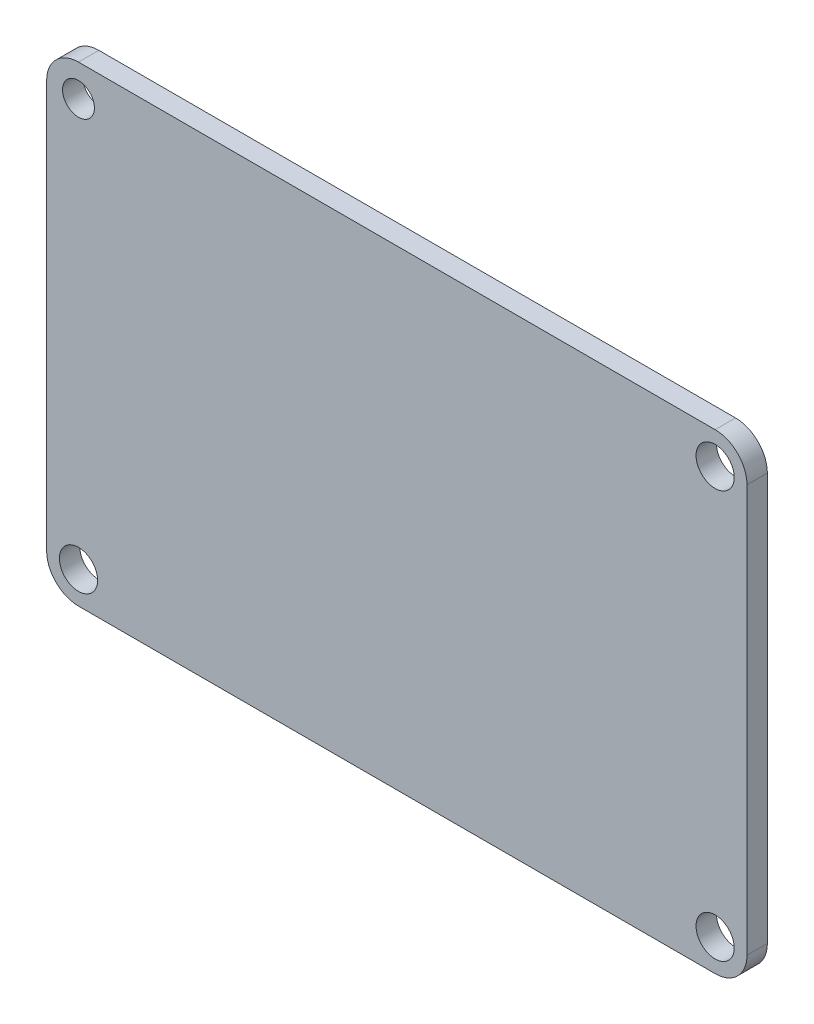
ISO-10303-21;
HEADER;
FILE_DESCRIPTION(('STEP AP214'),'2;1');
FILE_NAME('part.step','',(''),(''),'','','');
FILE_SCHEMA(('AUTOMOTIVE_DESIGN { 1 0 10303 214 1 1 1 1 }'));
ENDSEC;
DATA;
#1=APPLICATION_CONTEXT('core data for automotive mechanical design processes');
#2=APPLICATION_PROTOCOL_DEFINITION('international standard','automotive_design',2000,#1);
#3=PRODUCT_CONTEXT('',#1,'mechanical');
#4=PRODUCT('Part','Part','',(#3));
#5=PRODUCT_RELATED_PRODUCT_CATEGORY('part','',(#4));
#6=PRODUCT_DEFINITION_FORMATION('','',#4);
#7=PRODUCT_DEFINITION_CONTEXT('part definition',#1,'design');
#8=PRODUCT_DEFINITION('design','',#6,#7);
#9=PRODUCT_DEFINITION_SHAPE('','',#8);
#10=(LENGTH_UNIT() NAMED_UNIT(*) SI_UNIT(.MILLI.,.METRE.));
#11=(NAMED_UNIT(*) PLANE_ANGLE_UNIT() SI_UNIT($,.RADIAN.));
#12=(NAMED_UNIT(*) SI_UNIT($,.STERADIAN.) SOLID_ANGLE_UNIT());
#13=UNCERTAINTY_MEASURE_WITH_UNIT(LENGTH_MEASURE(1.E-05),#10,'distance_accuracy_value','');
#14=(GEOMETRIC_REPRESENTATION_CONTEXT(3) GLOBAL_UNCERTAINTY_ASSIGNED_CONTEXT((#13)) GLOBAL_UNIT_ASSIGNED_CONTEXT((#10,
#11,#12)) REPRESENTATION_CONTEXT('',''));
#15=CARTESIAN_POINT('',(0.,0.,0.));
#16=DIRECTION('',(0.,0.,1.));
#17=DIRECTION('',(1.,0.,0.));
#18=AXIS2_PLACEMENT_3D('',#15,#16,#17);
#19=CARTESIAN_POINT('',(27.5,-18.5,1.6));
#20=DIRECTION('',(-1.,0.,0.));
#21=DIRECTION('',(0.,0.,1.));
#22=AXIS2_PLACEMENT_3D('',#19,#20,#21);
#23=PLANE('',#22);
#24=DIRECTION('',(0.,0.,-1.));
#25=VECTOR('',#24,1.);
#26=CARTESIAN_POINT('',(27.5,16.,5.13553390593293));
#27=LINE('',#26,#25);
#28=CARTESIAN_POINT('',(27.5,16.,1.6));
#29=VERTEX_POINT('',#28);
#30=CARTESIAN_POINT('',(27.5,16.,0.));
#31=VERTEX_POINT('',#30);
#32=EDGE_CURVE('E106',#29,#31,#27,.T.);
#33=ORIENTED_EDGE('',*,*,#32,.F.);
#34=DIRECTION('',(0.,1.,0.));
#35=VECTOR('',#34,1.);
#36=CARTESIAN_POINT('',(27.5,-18.5,1.6));
#37=LINE('',#36,#35);
#38=CARTESIAN_POINT('',(27.5,-15.9999999999998,1.6));
#39=VERTEX_POINT('',#38);
#40=EDGE_CURVE('E136',#39,#29,#37,.T.);
#41=ORIENTED_EDGE('',*,*,#40,.F.);
#42=DIRECTION('',(0.,0.,-1.));
#43=VECTOR('',#42,1.);
#44=CARTESIAN_POINT('',(27.5,-15.9999999999998,5.13553390593293));
#45=LINE('',#44,#43);
#46=CARTESIAN_POINT('',(27.5,-15.9999999999998,0.));
#47=VERTEX_POINT('',#46);
#48=EDGE_CURVE('E141',#39,#47,#45,.T.);
#49=ORIENTED_EDGE('',*,*,#48,.T.);
#50=DIRECTION('',(0.,1.,0.));
#51=VECTOR('',#50,1.);
#52=CARTESIAN_POINT('',(27.5,-18.5,0.));
#53=LINE('',#52,#51);
#54=EDGE_CURVE('E127',#47,#31,#53,.T.);
#55=ORIENTED_EDGE('',*,*,#54,.T.);
#56=EDGE_LOOP('',(#33,#41,#49,#55));
#57=FACE_BOUND('',#56,.T.);
#58=ADVANCED_FACE('F35',(#57),#23,.F.);
#59=CARTESIAN_POINT('',(-27.5,18.5,1.6));
#60=DIRECTION('',(0.,-1.,0.));
#61=DIRECTION('',(0.,0.,-1.));
#62=AXIS2_PLACEMENT_3D('',#59,#60,#61);
#63=PLANE('',#62);
#64=DIRECTION('',(0.,0.,-1.));
#65=VECTOR('',#64,1.);
#66=CARTESIAN_POINT('',(-25.,18.5,5.13553390593293));
#67=LINE('',#66,#65);
#68=CARTESIAN_POINT('',(-25.,18.5,1.6));
#69=VERTEX_POINT('',#68);
#70=CARTESIAN_POINT('',(-25.,18.5,0.));
#71=VERTEX_POINT('',#70);
#72=EDGE_CURVE('E51',#69,#71,#67,.T.);
#73=ORIENTED_EDGE('',*,*,#72,.F.);
#74=DIRECTION('',(-1.,0.,0.));
#75=VECTOR('',#74,1.);
#76=CARTESIAN_POINT('',(-27.5,18.5,1.6));
#77=LINE('',#76,#75);
#78=CARTESIAN_POINT('',(24.9999999999999,18.5,1.6));
#79=VERTEX_POINT('',#78);
#80=EDGE_CURVE('E119',#79,#69,#77,.T.);
#81=ORIENTED_EDGE('',*,*,#80,.F.);
#82=DIRECTION('',(0.,0.,-1.));
#83=VECTOR('',#82,1.);
#84=CARTESIAN_POINT('',(24.9999999999999,18.5,5.13553390593293));
#85=LINE('',#84,#83);
#86=CARTESIAN_POINT('',(24.9999999999999,18.5,0.));
#87=VERTEX_POINT('',#86);
#88=EDGE_CURVE('E103',#79,#87,#85,.T.);
#89=ORIENTED_EDGE('',*,*,#88,.T.);
#90=DIRECTION('',(-1.,0.,0.));
#91=VECTOR('',#90,1.);
#92=CARTESIAN_POINT('',(-27.5,18.5,0.));
#93=LINE('',#92,#91);
#94=EDGE_CURVE('E117',#87,#71,#93,.T.);
#95=ORIENTED_EDGE('',*,*,#94,.T.);
#96=EDGE_LOOP('',(#73,#81,#89,#95));
#97=FACE_BOUND('',#96,.T.);
#98=ADVANCED_FACE('F116',(#97),#63,.F.);
#99=CARTESIAN_POINT('',(-27.5,-18.5,1.6));
#100=DIRECTION('',(1.,0.,0.));
#101=DIRECTION('',(0.,0.,-1.));
#102=AXIS2_PLACEMENT_3D('',#99,#100,#101);
#103=PLANE('',#102);
#104=DIRECTION('',(0.,0.,-1.));
#105=VECTOR('',#104,1.);
#106=CARTESIAN_POINT('',(-27.5,-16.,5.13553390593293));
#107=LINE('',#106,#105);
#108=CARTESIAN_POINT('',(-27.5,-16.,1.6));
#109=VERTEX_POINT('',#108);
#110=CARTESIAN_POINT('',(-27.5,-16.,0.));
#111=VERTEX_POINT('',#110);
#112=EDGE_CURVE('E59',#109,#111,#107,.T.);
#113=ORIENTED_EDGE('',*,*,#112,.F.);
#114=DIRECTION('',(0.,-1.,0.));
#115=VECTOR('',#114,1.);
#116=CARTESIAN_POINT('',(-27.5,-18.5,1.6));
#117=LINE('',#116,#115);
#118=CARTESIAN_POINT('',(-27.5,16.,1.6));
#119=VERTEX_POINT('',#118);
#120=EDGE_CURVE('E43',#119,#109,#117,.T.);
#121=ORIENTED_EDGE('',*,*,#120,.F.);
#122=DIRECTION('',(0.,0.,-1.));
#123=VECTOR('',#122,1.);
#124=CARTESIAN_POINT('',(-27.5,16.,5.13553390593293));
#125=LINE('',#124,#123);
#126=CARTESIAN_POINT('',(-27.5,16.,0.));
#127=VERTEX_POINT('',#126);
#128=EDGE_CURVE('E159',#119,#127,#125,.T.);
#129=ORIENTED_EDGE('',*,*,#128,.T.);
#130=DIRECTION('',(0.,-1.,0.));
#131=VECTOR('',#130,1.);
#132=CARTESIAN_POINT('',(-27.5,-18.5,0.));
#133=LINE('',#132,#131);
#134=EDGE_CURVE('E126',#127,#111,#133,.T.);
#135=ORIENTED_EDGE('',*,*,#134,.T.);
#136=EDGE_LOOP('',(#113,#121,#129,#135));
#137=FACE_BOUND('',#136,.T.);
#138=ADVANCED_FACE('F223',(#137),#103,.F.);
#139=CARTESIAN_POINT('',(-27.5,-18.5,1.6));
#140=DIRECTION('',(0.,1.,0.));
#141=DIRECTION('',(0.,0.,1.));
#142=AXIS2_PLACEMENT_3D('',#139,#140,#141);
#143=PLANE('',#142);
#144=DIRECTION('',(1.,0.,0.));
#145=VECTOR('',#144,1.);
#146=CARTESIAN_POINT('',(-27.5,-18.5,1.6));
#147=LINE('',#146,#145);
#148=CARTESIAN_POINT('',(-25.,-18.5,1.6));
#149=VERTEX_POINT('',#148);
#150=CARTESIAN_POINT('',(25.0000000000001,-18.5,1.6));
#151=VERTEX_POINT('',#150);
#152=EDGE_CURVE('E11',#149,#151,#147,.T.);
#153=ORIENTED_EDGE('',*,*,#152,.F.);
#154=DIRECTION('',(0.,0.,-1.));
#155=VECTOR('',#154,1.);
#156=CARTESIAN_POINT('',(-25.,-18.5,5.13553390593293));
#157=LINE('',#156,#155);
#158=CARTESIAN_POINT('',(-25.,-18.5,0.));
#159=VERTEX_POINT('',#158);
#160=EDGE_CURVE('E151',#149,#159,#157,.T.);
#161=ORIENTED_EDGE('',*,*,#160,.T.);
#162=DIRECTION('',(1.,0.,0.));
#163=VECTOR('',#162,1.);
#164=CARTESIAN_POINT('',(-27.5,-18.5,0.));
#165=LINE('',#164,#163);
#166=CARTESIAN_POINT('',(25.0000000000001,-18.5,0.));
#167=VERTEX_POINT('',#166);
#168=EDGE_CURVE('E38',#159,#167,#165,.T.);
#169=ORIENTED_EDGE('',*,*,#168,.T.);
#170=DIRECTION('',(0.,0.,-1.));
#171=VECTOR('',#170,1.);
#172=CARTESIAN_POINT('',(25.0000000000001,-18.5,5.13553390593293));
#173=LINE('',#172,#171);
#174=EDGE_CURVE('E139',#151,#167,#173,.T.);
#175=ORIENTED_EDGE('',*,*,#174,.F.);
#176=EDGE_LOOP('',(#153,#161,#169,#175));
#177=FACE_BOUND('',#176,.T.);
#178=ADVANCED_FACE('F231',(#177),#143,.F.);
#179=CARTESIAN_POINT('',(0.,0.,1.6));
#180=DIRECTION('',(0.,0.,-1.));
#181=DIRECTION('',(-1.,0.,0.));
#182=AXIS2_PLACEMENT_3D('',#179,#180,#181);
#183=PLANE('',#182);
#184=CARTESIAN_POINT('',(-25.,-16.,1.6));
#185=DIRECTION('',(0.,0.,-1.));
#186=DIRECTION('',(-1.,0.,0.));
#187=AXIS2_PLACEMENT_3D('',#184,#185,#186);
#188=CIRCLE('',#187,1.5);
#189=CARTESIAN_POINT('',(-26.5,-16.,1.6));
#190=VERTEX_POINT('',#189);
#191=EDGE_CURVE('E173',#190,#190,#188,.F.);
#192=ORIENTED_EDGE('',*,*,#191,.F.);
#193=EDGE_LOOP('',(#192));
#194=FACE_BOUND('',#193,.T.);
#195=CARTESIAN_POINT('',(24.9999999999999,16.,1.6));
#196=DIRECTION('',(0.,0.,-1.));
#197=DIRECTION('',(-1.,0.,0.));
#198=AXIS2_PLACEMENT_3D('',#195,#196,#197);
#199=CIRCLE('',#198,1.5);
#200=CARTESIAN_POINT('',(23.4999999999999,16.,1.6));
#201=VERTEX_POINT('',#200);
#202=EDGE_CURVE('E174',#201,#201,#199,.F.);
#203=ORIENTED_EDGE('',*,*,#202,.F.);
#204=EDGE_LOOP('',(#203));
#205=FACE_BOUND('',#204,.T.);
#206=CARTESIAN_POINT('',(25.0000000000001,-15.9999999999998,1.6));
#207=DIRECTION('',(0.,0.,-1.));
#208=DIRECTION('',(-1.,0.,0.));
#209=AXIS2_PLACEMENT_3D('',#206,#207,#208);
#210=CIRCLE('',#209,1.5);
#211=CARTESIAN_POINT('',(23.5000000000001,-15.9999999999998,1.6));
#212=VERTEX_POINT('',#211);
#213=EDGE_CURVE('E181',#212,#212,#210,.F.);
#214=ORIENTED_EDGE('',*,*,#213,.F.);
#215=EDGE_LOOP('',(#214));
#216=FACE_BOUND('',#215,.T.);
#217=CARTESIAN_POINT('',(-25.,16.,1.6));
#218=DIRECTION('',(0.,0.,-1.));
#219=DIRECTION('',(-1.,0.,0.));
#220=AXIS2_PLACEMENT_3D('',#217,#218,#219);
#221=CIRCLE('',#220,1.25036381722104);
#222=CARTESIAN_POINT('',(-26.250363817221,16.,1.6));
#223=VERTEX_POINT('',#222);
#224=EDGE_CURVE('E156',#223,#223,#221,.F.);
#225=ORIENTED_EDGE('',*,*,#224,.F.);
#226=EDGE_LOOP('',(#225));
#227=FACE_BOUND('',#226,.T.);
#228=CARTESIAN_POINT('',(-25.,-16.,1.6));
#229=DIRECTION('',(0.,0.,-1.));
#230=DIRECTION('',(-1.,0.,0.));
#231=AXIS2_PLACEMENT_3D('',#228,#229,#230);
#232=CIRCLE('',#231,2.5);
#233=EDGE_CURVE('E150',#109,#149,#232,.F.);
#234=ORIENTED_EDGE('',*,*,#233,.T.);
#235=ORIENTED_EDGE('',*,*,#152,.T.);
#236=CARTESIAN_POINT('',(25.0000000000001,-15.9999999999998,1.6));
#237=DIRECTION('',(0.,0.,-1.));
#238=DIRECTION('',(-1.,0.,0.));
#239=AXIS2_PLACEMENT_3D('',#236,#237,#238);
#240=CIRCLE('',#239,2.50000000000005);
#241=EDGE_CURVE('E130',#151,#39,#240,.F.);
#242=ORIENTED_EDGE('',*,*,#241,.T.);
#243=ORIENTED_EDGE('',*,*,#40,.T.);
#244=CARTESIAN_POINT('',(24.9999999999999,16.,1.6));
#245=DIRECTION('',(0.,0.,-1.));
#246=DIRECTION('',(-1.,0.,0.));
#247=AXIS2_PLACEMENT_3D('',#244,#245,#246);
#248=CIRCLE('',#247,2.50000000000005);
#249=EDGE_CURVE('E120',#29,#79,#248,.F.);
#250=ORIENTED_EDGE('',*,*,#249,.T.);
#251=ORIENTED_EDGE('',*,*,#80,.T.);
#252=CARTESIAN_POINT('',(-25.,16.,1.6));
#253=DIRECTION('',(0.,0.,-1.));
#254=DIRECTION('',(-1.,0.,0.));
#255=AXIS2_PLACEMENT_3D('',#252,#253,#254);
#256=CIRCLE('',#255,2.5);
#257=EDGE_CURVE('E111',#69,#119,#256,.F.);
#258=ORIENTED_EDGE('',*,*,#257,.T.);
#259=ORIENTED_EDGE('',*,*,#120,.T.);
#260=EDGE_LOOP('',(#234,#235,#242,#243,#250,#251,#258,#259));
#261=FACE_BOUND('',#260,.T.);
#262=ADVANCED_FACE('F197',(#194,#205,#216,#227,#261),#183,.F.);
#263=CARTESIAN_POINT('',(0.,0.,0.));
#264=DIRECTION('',(0.,0.,-1.));
#265=DIRECTION('',(-1.,0.,0.));
#266=AXIS2_PLACEMENT_3D('',#263,#264,#265);
#267=PLANE('',#266);
#268=CARTESIAN_POINT('',(-25.,-16.,0.));
#269=DIRECTION('',(0.,0.,-1.));
#270=DIRECTION('',(-1.,0.,0.));
#271=AXIS2_PLACEMENT_3D('',#268,#269,#270);
#272=CIRCLE('',#271,1.5);
#273=CARTESIAN_POINT('',(-26.5,-16.,0.));
#274=VERTEX_POINT('',#273);
#275=EDGE_CURVE('E177',#274,#274,#272,.T.);
#276=ORIENTED_EDGE('',*,*,#275,.F.);
#277=EDGE_LOOP('',(#276));
#278=FACE_BOUND('',#277,.T.);
#279=CARTESIAN_POINT('',(24.9999999999999,16.,0.));
#280=DIRECTION('',(0.,0.,-1.));
#281=DIRECTION('',(-1.,0.,0.));
#282=AXIS2_PLACEMENT_3D('',#279,#280,#281);
#283=CIRCLE('',#282,1.5);
#284=CARTESIAN_POINT('',(23.4999999999999,16.,0.));
#285=VERTEX_POINT('',#284);
#286=EDGE_CURVE('E178',#285,#285,#283,.T.);
#287=ORIENTED_EDGE('',*,*,#286,.F.);
#288=EDGE_LOOP('',(#287));
#289=FACE_BOUND('',#288,.T.);
#290=CARTESIAN_POINT('',(25.0000000000001,-15.9999999999998,0.));
#291=DIRECTION('',(0.,0.,-1.));
#292=DIRECTION('',(-1.,0.,0.));
#293=AXIS2_PLACEMENT_3D('',#290,#291,#292);
#294=CIRCLE('',#293,1.5);
#295=CARTESIAN_POINT('',(23.5000000000001,-15.9999999999998,0.));
#296=VERTEX_POINT('',#295);
#297=EDGE_CURVE('E188',#296,#296,#294,.T.);
#298=ORIENTED_EDGE('',*,*,#297,.F.);
#299=EDGE_LOOP('',(#298));
#300=FACE_BOUND('',#299,.T.);
#301=CARTESIAN_POINT('',(-25.,16.,0.));
#302=DIRECTION('',(0.,0.,-1.));
#303=DIRECTION('',(-1.,0.,0.));
#304=AXIS2_PLACEMENT_3D('',#301,#302,#303);
#305=CIRCLE('',#304,1.25036381722104);
#306=CARTESIAN_POINT('',(-26.250363817221,16.,0.));
#307=VERTEX_POINT('',#306);
#308=EDGE_CURVE('E170',#307,#307,#305,.T.);
#309=ORIENTED_EDGE('',*,*,#308,.F.);
#310=EDGE_LOOP('',(#309));
#311=FACE_BOUND('',#310,.T.);
#312=ORIENTED_EDGE('',*,*,#168,.F.);
#313=CARTESIAN_POINT('',(-25.,-16.,0.));
#314=DIRECTION('',(0.,0.,-1.));
#315=DIRECTION('',(-1.,0.,0.));
#316=AXIS2_PLACEMENT_3D('',#313,#314,#315);
#317=CIRCLE('',#316,2.5);
#318=EDGE_CURVE('E154',#159,#111,#317,.T.);
#319=ORIENTED_EDGE('',*,*,#318,.T.);
#320=ORIENTED_EDGE('',*,*,#134,.F.);
#321=CARTESIAN_POINT('',(-25.,16.,0.));
#322=DIRECTION('',(0.,0.,-1.));
#323=DIRECTION('',(-1.,0.,0.));
#324=AXIS2_PLACEMENT_3D('',#321,#322,#323);
#325=CIRCLE('',#324,2.5);
#326=EDGE_CURVE('E125',#127,#71,#325,.T.);
#327=ORIENTED_EDGE('',*,*,#326,.T.);
#328=ORIENTED_EDGE('',*,*,#94,.F.);
#329=CARTESIAN_POINT('',(24.9999999999999,16.,0.));
#330=DIRECTION('',(0.,0.,-1.));
#331=DIRECTION('',(-1.,0.,0.));
#332=AXIS2_PLACEMENT_3D('',#329,#330,#331);
#333=CIRCLE('',#332,2.50000000000005);
#334=EDGE_CURVE('E100',#87,#31,#333,.T.);
#335=ORIENTED_EDGE('',*,*,#334,.T.);
#336=ORIENTED_EDGE('',*,*,#54,.F.);
#337=CARTESIAN_POINT('',(25.0000000000001,-15.9999999999998,0.));
#338=DIRECTION('',(0.,0.,-1.));
#339=DIRECTION('',(-1.,0.,0.));
#340=AXIS2_PLACEMENT_3D('',#337,#338,#339);
#341=CIRCLE('',#340,2.50000000000005);
#342=EDGE_CURVE('E144',#47,#167,#341,.T.);
#343=ORIENTED_EDGE('',*,*,#342,.T.);
#344=EDGE_LOOP('',(#312,#319,#320,#327,#328,#335,#336,#343));
#345=FACE_BOUND('',#344,.T.);
#346=ADVANCED_FACE('F123',(#278,#289,#300,#311,#345),#267,.T.);
#347=CARTESIAN_POINT('',(25.0000000000001,-15.9999999999998,5.13553390593293));
#348=DIRECTION('',(0.,0.,-1.));
#349=DIRECTION('',(-1.,0.,0.));
#350=AXIS2_PLACEMENT_3D('',#347,#348,#349);
#351=CYLINDRICAL_SURFACE('',#350,2.50000000000005);
#352=ORIENTED_EDGE('',*,*,#174,.T.);
#353=ORIENTED_EDGE('',*,*,#342,.F.);
#354=ORIENTED_EDGE('',*,*,#48,.F.);
#355=ORIENTED_EDGE('',*,*,#241,.F.);
#356=EDGE_LOOP('',(#352,#353,#354,#355));
#357=FACE_BOUND('',#356,.T.);
#358=ADVANCED_FACE('F196',(#357),#351,.T.);
#359=CARTESIAN_POINT('',(24.9999999999999,16.,5.13553390593293));
#360=DIRECTION('',(0.,0.,-1.));
#361=DIRECTION('',(-1.,0.,0.));
#362=AXIS2_PLACEMENT_3D('',#359,#360,#361);
#363=CYLINDRICAL_SURFACE('',#362,2.50000000000005);
#364=ORIENTED_EDGE('',*,*,#32,.T.);
#365=ORIENTED_EDGE('',*,*,#334,.F.);
#366=ORIENTED_EDGE('',*,*,#88,.F.);
#367=ORIENTED_EDGE('',*,*,#249,.F.);
#368=EDGE_LOOP('',(#364,#365,#366,#367));
#369=FACE_BOUND('',#368,.T.);
#370=ADVANCED_FACE('F102',(#369),#363,.T.);
#371=CARTESIAN_POINT('',(-25.,16.,5.13553390593293));
#372=DIRECTION('',(0.,0.,-1.));
#373=DIRECTION('',(-1.,0.,0.));
#374=AXIS2_PLACEMENT_3D('',#371,#372,#373);
#375=CYLINDRICAL_SURFACE('',#374,2.5);
#376=ORIENTED_EDGE('',*,*,#72,.T.);
#377=ORIENTED_EDGE('',*,*,#326,.F.);
#378=ORIENTED_EDGE('',*,*,#128,.F.);
#379=ORIENTED_EDGE('',*,*,#257,.F.);
#380=EDGE_LOOP('',(#376,#377,#378,#379));
#381=FACE_BOUND('',#380,.T.);
#382=ADVANCED_FACE('F214',(#381),#375,.T.);
#383=CARTESIAN_POINT('',(-25.,-16.,5.13553390593293));
#384=DIRECTION('',(0.,0.,-1.));
#385=DIRECTION('',(-1.,0.,0.));
#386=AXIS2_PLACEMENT_3D('',#383,#384,#385);
#387=CYLINDRICAL_SURFACE('',#386,2.5);
#388=ORIENTED_EDGE('',*,*,#112,.T.);
#389=ORIENTED_EDGE('',*,*,#318,.F.);
#390=ORIENTED_EDGE('',*,*,#160,.F.);
#391=ORIENTED_EDGE('',*,*,#233,.F.);
#392=EDGE_LOOP('',(#388,#389,#390,#391));
#393=FACE_BOUND('',#392,.T.);
#394=ADVANCED_FACE('F204',(#393),#387,.T.);
#395=CARTESIAN_POINT('',(-25.,16.,5.84264068711929));
#396=DIRECTION('',(0.,0.,-1.));
#397=DIRECTION('',(-1.,0.,0.));
#398=AXIS2_PLACEMENT_3D('',#395,#396,#397);
#399=CYLINDRICAL_SURFACE('',#398,1.25036381722104);
#400=ORIENTED_EDGE('',*,*,#224,.T.);
#401=EDGE_LOOP('',(#400));
#402=FACE_BOUND('',#401,.T.);
#403=ORIENTED_EDGE('',*,*,#308,.T.);
#404=EDGE_LOOP('',(#403));
#405=FACE_BOUND('',#404,.T.);
#406=ADVANCED_FACE('F202',(#402,#405),#399,.F.);
#407=CARTESIAN_POINT('',(25.0000000000001,-15.9999999999998,5.84264068711929));
#408=DIRECTION('',(0.,0.,-1.));
#409=DIRECTION('',(-1.,0.,0.));
#410=AXIS2_PLACEMENT_3D('',#407,#408,#409);
#411=CYLINDRICAL_SURFACE('',#410,1.5);
#412=ORIENTED_EDGE('',*,*,#213,.T.);
#413=EDGE_LOOP('',(#412));
#414=FACE_BOUND('',#413,.T.);
#415=ORIENTED_EDGE('',*,*,#297,.T.);
#416=EDGE_LOOP('',(#415));
#417=FACE_BOUND('',#416,.T.);
#418=ADVANCED_FACE('F192',(#414,#417),#411,.F.);
#419=CARTESIAN_POINT('',(24.9999999999999,16.,5.84264068711929));
#420=DIRECTION('',(0.,0.,-1.));
#421=DIRECTION('',(-1.,0.,0.));
#422=AXIS2_PLACEMENT_3D('',#419,#420,#421);
#423=CYLINDRICAL_SURFACE('',#422,1.5);
#424=ORIENTED_EDGE('',*,*,#202,.T.);
#425=EDGE_LOOP('',(#424));
#426=FACE_BOUND('',#425,.T.);
#427=ORIENTED_EDGE('',*,*,#286,.T.);
#428=EDGE_LOOP('',(#427));
#429=FACE_BOUND('',#428,.T.);
#430=ADVANCED_FACE('F211',(#426,#429),#423,.F.);
#431=CARTESIAN_POINT('',(-25.,-16.,5.84264068711929));
#432=DIRECTION('',(0.,0.,-1.));
#433=DIRECTION('',(-1.,0.,0.));
#434=AXIS2_PLACEMENT_3D('',#431,#432,#433);
#435=CYLINDRICAL_SURFACE('',#434,1.5);
#436=ORIENTED_EDGE('',*,*,#191,.T.);
#437=EDGE_LOOP('',(#436));
#438=FACE_BOUND('',#437,.T.);
#439=ORIENTED_EDGE('',*,*,#275,.T.);
#440=EDGE_LOOP('',(#439));
#441=FACE_BOUND('',#440,.T.);
#442=ADVANCED_FACE('F301',(#438,#441),#435,.F.);
#443=CLOSED_SHELL('',(#58,#98,#138,#178,#262,#346,#358,#370,#382,#394,#406,#418,#430,#442));
#444=MANIFOLD_SOLID_BREP('B2',#443);
#445=ADVANCED_BREP_SHAPE_REPRESENTATION('',(#18,#444),#14);
#446=SHAPE_DEFINITION_REPRESENTATION(#9,#445);
ENDSEC;
END-ISO-10303-21;
